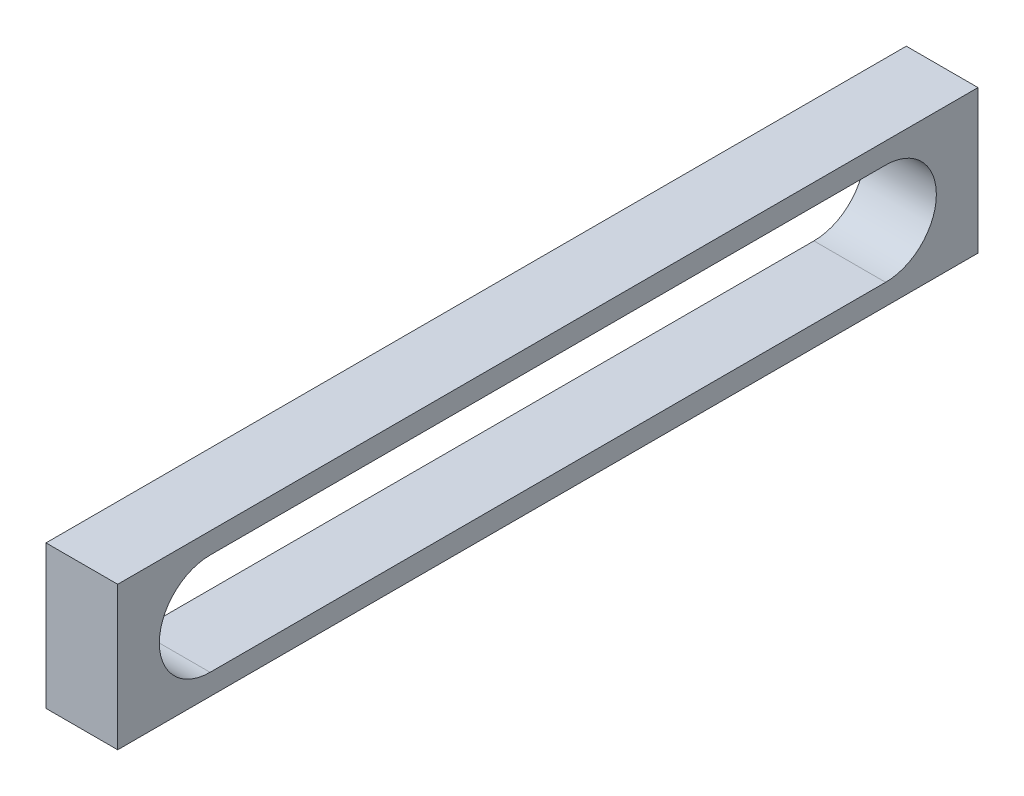
ISO-10303-21;
HEADER;
FILE_DESCRIPTION(('STEP AP214'),'2;1');
FILE_NAME('part.step','',(''),(''),'','','');
FILE_SCHEMA(('AUTOMOTIVE_DESIGN { 1 0 10303 214 1 1 1 1 }'));
ENDSEC;
DATA;
#1=APPLICATION_CONTEXT('core data for automotive mechanical design processes');
#2=APPLICATION_PROTOCOL_DEFINITION('international standard','automotive_design',2000,#1);
#3=PRODUCT_CONTEXT('',#1,'mechanical');
#4=PRODUCT('Part','Part','',(#3));
#5=PRODUCT_RELATED_PRODUCT_CATEGORY('part','',(#4));
#6=PRODUCT_DEFINITION_FORMATION('','',#4);
#7=PRODUCT_DEFINITION_CONTEXT('part definition',#1,'design');
#8=PRODUCT_DEFINITION('design','',#6,#7);
#9=PRODUCT_DEFINITION_SHAPE('','',#8);
#10=(LENGTH_UNIT() NAMED_UNIT(*) SI_UNIT(.MILLI.,.METRE.));
#11=(NAMED_UNIT(*) PLANE_ANGLE_UNIT() SI_UNIT($,.RADIAN.));
#12=(NAMED_UNIT(*) SI_UNIT($,.STERADIAN.) SOLID_ANGLE_UNIT());
#13=UNCERTAINTY_MEASURE_WITH_UNIT(LENGTH_MEASURE(1.E-05),#10,'distance_accuracy_value','');
#14=(GEOMETRIC_REPRESENTATION_CONTEXT(3) GLOBAL_UNCERTAINTY_ASSIGNED_CONTEXT((#13)) GLOBAL_UNIT_ASSIGNED_CONTEXT((#10,
#11,#12)) REPRESENTATION_CONTEXT('',''));
#15=CARTESIAN_POINT('',(0.,0.,0.));
#16=DIRECTION('',(0.,0.,1.));
#17=DIRECTION('',(1.,0.,0.));
#18=AXIS2_PLACEMENT_3D('',#15,#16,#17);
#19=CARTESIAN_POINT('',(12.7,0.,0.));
#20=DIRECTION('',(0.,0.,1.));
#21=DIRECTION('',(0.,-1.,0.));
#22=AXIS2_PLACEMENT_3D('',#19,#20,#21);
#23=PLANE('',#22);
#24=DIRECTION('',(0.,1.,0.));
#25=VECTOR('',#24,1.);
#26=CARTESIAN_POINT('',(0.,0.,0.));
#27=LINE('',#26,#25);
#28=CARTESIAN_POINT('',(0.,0.,0.));
#29=VERTEX_POINT('',#28);
#30=CARTESIAN_POINT('',(0.,25.4,0.));
#31=VERTEX_POINT('',#30);
#32=EDGE_CURVE('E124',#29,#31,#27,.T.);
#33=ORIENTED_EDGE('',*,*,#32,.T.);
#34=DIRECTION('',(-1.,0.,0.));
#35=VECTOR('',#34,1.);
#36=CARTESIAN_POINT('',(12.7,25.4,0.));
#37=LINE('',#36,#35);
#38=CARTESIAN_POINT('',(12.7,25.4,0.));
#39=VERTEX_POINT('',#38);
#40=EDGE_CURVE('E11',#39,#31,#37,.T.);
#41=ORIENTED_EDGE('',*,*,#40,.F.);
#42=DIRECTION('',(0.,1.,0.));
#43=VECTOR('',#42,1.);
#44=CARTESIAN_POINT('',(12.7,0.,0.));
#45=LINE('',#44,#43);
#46=CARTESIAN_POINT('',(12.7,0.,0.));
#47=VERTEX_POINT('',#46);
#48=EDGE_CURVE('E156',#47,#39,#45,.T.);
#49=ORIENTED_EDGE('',*,*,#48,.F.);
#50=DIRECTION('',(-1.,0.,0.));
#51=VECTOR('',#50,1.);
#52=CARTESIAN_POINT('',(12.7,0.,0.));
#53=LINE('',#52,#51);
#54=EDGE_CURVE('E170',#47,#29,#53,.T.);
#55=ORIENTED_EDGE('',*,*,#54,.T.);
#56=EDGE_LOOP('',(#33,#41,#49,#55));
#57=FACE_BOUND('',#56,.T.);
#58=ADVANCED_FACE('F43',(#57),#23,.F.);
#59=CARTESIAN_POINT('',(12.7,25.4,0.));
#60=DIRECTION('',(0.,-1.,0.));
#61=DIRECTION('',(0.,0.,-1.));
#62=AXIS2_PLACEMENT_3D('',#59,#60,#61);
#63=PLANE('',#62);
#64=DIRECTION('',(0.,0.,1.));
#65=VECTOR('',#64,1.);
#66=CARTESIAN_POINT('',(0.,25.4,0.));
#67=LINE('',#66,#65);
#68=CARTESIAN_POINT('',(0.,25.4,152.4));
#69=VERTEX_POINT('',#68);
#70=EDGE_CURVE('E174',#31,#69,#67,.T.);
#71=ORIENTED_EDGE('',*,*,#70,.T.);
#72=DIRECTION('',(-1.,0.,0.));
#73=VECTOR('',#72,1.);
#74=CARTESIAN_POINT('',(12.7,25.4,152.4));
#75=LINE('',#74,#73);
#76=CARTESIAN_POINT('',(12.7,25.4,152.4));
#77=VERTEX_POINT('',#76);
#78=EDGE_CURVE('E51',#77,#69,#75,.T.);
#79=ORIENTED_EDGE('',*,*,#78,.F.);
#80=DIRECTION('',(0.,0.,1.));
#81=VECTOR('',#80,1.);
#82=CARTESIAN_POINT('',(12.7,25.4,0.));
#83=LINE('',#82,#81);
#84=EDGE_CURVE('E160',#39,#77,#83,.T.);
#85=ORIENTED_EDGE('',*,*,#84,.F.);
#86=ORIENTED_EDGE('',*,*,#40,.T.);
#87=EDGE_LOOP('',(#71,#79,#85,#86));
#88=FACE_BOUND('',#87,.T.);
#89=ADVANCED_FACE('F208',(#88),#63,.F.);
#90=CARTESIAN_POINT('',(12.7,0.,152.4));
#91=DIRECTION('',(0.,0.,-1.));
#92=DIRECTION('',(-1.,0.,0.));
#93=AXIS2_PLACEMENT_3D('',#90,#91,#92);
#94=PLANE('',#93);
#95=DIRECTION('',(0.,-1.,0.));
#96=VECTOR('',#95,1.);
#97=CARTESIAN_POINT('',(0.,0.,152.4));
#98=LINE('',#97,#96);
#99=CARTESIAN_POINT('',(0.,0.,152.4));
#100=VERTEX_POINT('',#99);
#101=EDGE_CURVE('E177',#69,#100,#98,.T.);
#102=ORIENTED_EDGE('',*,*,#101,.T.);
#103=DIRECTION('',(-1.,0.,0.));
#104=VECTOR('',#103,1.);
#105=CARTESIAN_POINT('',(12.7,0.,152.4));
#106=LINE('',#105,#104);
#107=CARTESIAN_POINT('',(12.7,0.,152.4));
#108=VERTEX_POINT('',#107);
#109=EDGE_CURVE('E185',#108,#100,#106,.T.);
#110=ORIENTED_EDGE('',*,*,#109,.F.);
#111=DIRECTION('',(0.,-1.,0.));
#112=VECTOR('',#111,1.);
#113=CARTESIAN_POINT('',(12.7,0.,152.4));
#114=LINE('',#113,#112);
#115=EDGE_CURVE('E164',#77,#108,#114,.T.);
#116=ORIENTED_EDGE('',*,*,#115,.F.);
#117=ORIENTED_EDGE('',*,*,#78,.T.);
#118=EDGE_LOOP('',(#102,#110,#116,#117));
#119=FACE_BOUND('',#118,.T.);
#120=ADVANCED_FACE('F194',(#119),#94,.F.);
#121=CARTESIAN_POINT('',(12.7,0.,0.));
#122=DIRECTION('',(0.,1.,0.));
#123=DIRECTION('',(0.,0.,1.));
#124=AXIS2_PLACEMENT_3D('',#121,#122,#123);
#125=PLANE('',#124);
#126=DIRECTION('',(0.,0.,-1.));
#127=VECTOR('',#126,1.);
#128=CARTESIAN_POINT('',(0.,0.,0.));
#129=LINE('',#128,#127);
#130=EDGE_CURVE('E161',#100,#29,#129,.T.);
#131=ORIENTED_EDGE('',*,*,#130,.T.);
#132=ORIENTED_EDGE('',*,*,#54,.F.);
#133=DIRECTION('',(0.,0.,-1.));
#134=VECTOR('',#133,1.);
#135=CARTESIAN_POINT('',(12.7,0.,0.));
#136=LINE('',#135,#134);
#137=EDGE_CURVE('E167',#108,#47,#136,.T.);
#138=ORIENTED_EDGE('',*,*,#137,.F.);
#139=ORIENTED_EDGE('',*,*,#109,.T.);
#140=EDGE_LOOP('',(#131,#132,#138,#139));
#141=FACE_BOUND('',#140,.T.);
#142=ADVANCED_FACE('F201',(#141),#125,.F.);
#143=CARTESIAN_POINT('',(12.7,0.,0.));
#144=DIRECTION('',(1.,0.,0.));
#145=DIRECTION('',(0.,0.,-1.));
#146=AXIS2_PLACEMENT_3D('',#143,#144,#145);
#147=PLANE('',#146);
#148=CARTESIAN_POINT('',(12.7,12.7,136.033448355187));
#149=DIRECTION('',(1.,0.,0.));
#150=DIRECTION('',(0.,0.,-1.));
#151=AXIS2_PLACEMENT_3D('',#148,#149,#150);
#152=CIRCLE('',#151,8.99084286875344);
#153=CARTESIAN_POINT('',(12.7,21.6908428687534,136.033448355187));
#154=VERTEX_POINT('',#153);
#155=CARTESIAN_POINT('',(12.7,3.70915713124654,136.033448355187));
#156=VERTEX_POINT('',#155);
#157=EDGE_CURVE('E58',#154,#156,#152,.T.);
#158=ORIENTED_EDGE('',*,*,#157,.F.);
#159=DIRECTION('',(0.,0.,1.));
#160=VECTOR('',#159,1.);
#161=CARTESIAN_POINT('',(12.7,21.6908428687534,136.033448355187));
#162=LINE('',#161,#160);
#163=CARTESIAN_POINT('',(12.7,21.6908428687534,16.3665516448125));
#164=VERTEX_POINT('',#163);
#165=EDGE_CURVE('E117',#164,#154,#162,.T.);
#166=ORIENTED_EDGE('',*,*,#165,.F.);
#167=CARTESIAN_POINT('',(12.7,12.7,16.3665516448125));
#168=DIRECTION('',(1.,0.,0.));
#169=DIRECTION('',(0.,0.,-1.));
#170=AXIS2_PLACEMENT_3D('',#167,#168,#169);
#171=CIRCLE('',#170,8.99084286875344);
#172=CARTESIAN_POINT('',(12.7,3.70915713124654,16.3665516448125));
#173=VERTEX_POINT('',#172);
#174=EDGE_CURVE('E142',#173,#164,#171,.T.);
#175=ORIENTED_EDGE('',*,*,#174,.F.);
#176=DIRECTION('',(0.,0.,-1.));
#177=VECTOR('',#176,1.);
#178=CARTESIAN_POINT('',(12.7,3.70915713124654,136.033448355187));
#179=LINE('',#178,#177);
#180=EDGE_CURVE('E135',#156,#173,#179,.T.);
#181=ORIENTED_EDGE('',*,*,#180,.F.);
#182=EDGE_LOOP('',(#158,#166,#175,#181));
#183=FACE_BOUND('',#182,.T.);
#184=ORIENTED_EDGE('',*,*,#48,.T.);
#185=ORIENTED_EDGE('',*,*,#84,.T.);
#186=ORIENTED_EDGE('',*,*,#115,.T.);
#187=ORIENTED_EDGE('',*,*,#137,.T.);
#188=EDGE_LOOP('',(#184,#185,#186,#187));
#189=FACE_BOUND('',#188,.T.);
#190=ADVANCED_FACE('F207',(#183,#189),#147,.T.);
#191=CARTESIAN_POINT('',(0.,0.,0.));
#192=DIRECTION('',(1.,0.,0.));
#193=DIRECTION('',(0.,0.,-1.));
#194=AXIS2_PLACEMENT_3D('',#191,#192,#193);
#195=PLANE('',#194);
#196=DIRECTION('',(0.,0.,-1.));
#197=VECTOR('',#196,1.);
#198=CARTESIAN_POINT('',(0.,21.6908428687534,136.033448355187));
#199=LINE('',#198,#197);
#200=CARTESIAN_POINT('',(0.,21.6908428687534,136.033448355187));
#201=VERTEX_POINT('',#200);
#202=CARTESIAN_POINT('',(0.,21.6908428687534,16.3665516448125));
#203=VERTEX_POINT('',#202);
#204=EDGE_CURVE('E130',#201,#203,#199,.T.);
#205=ORIENTED_EDGE('',*,*,#204,.F.);
#206=CARTESIAN_POINT('',(0.,12.7,136.033448355187));
#207=DIRECTION('',(1.,0.,0.));
#208=DIRECTION('',(0.,0.,-1.));
#209=AXIS2_PLACEMENT_3D('',#206,#207,#208);
#210=CIRCLE('',#209,8.99084286875344);
#211=CARTESIAN_POINT('',(0.,3.70915713124654,136.033448355187));
#212=VERTEX_POINT('',#211);
#213=EDGE_CURVE('E110',#212,#201,#210,.F.);
#214=ORIENTED_EDGE('',*,*,#213,.F.);
#215=DIRECTION('',(0.,0.,1.));
#216=VECTOR('',#215,1.);
#217=CARTESIAN_POINT('',(0.,3.70915713124654,136.033448355187));
#218=LINE('',#217,#216);
#219=CARTESIAN_POINT('',(0.,3.70915713124656,16.3665516448125));
#220=VERTEX_POINT('',#219);
#221=EDGE_CURVE('E120',#220,#212,#218,.T.);
#222=ORIENTED_EDGE('',*,*,#221,.F.);
#223=CARTESIAN_POINT('',(0.,12.7,16.3665516448125));
#224=DIRECTION('',(1.,0.,0.));
#225=DIRECTION('',(0.,0.,-1.));
#226=AXIS2_PLACEMENT_3D('',#223,#224,#225);
#227=CIRCLE('',#226,8.99084286875344);
#228=EDGE_CURVE('E66',#203,#220,#227,.F.);
#229=ORIENTED_EDGE('',*,*,#228,.F.);
#230=EDGE_LOOP('',(#205,#214,#222,#229));
#231=FACE_BOUND('',#230,.T.);
#232=ORIENTED_EDGE('',*,*,#32,.F.);
#233=ORIENTED_EDGE('',*,*,#130,.F.);
#234=ORIENTED_EDGE('',*,*,#101,.F.);
#235=ORIENTED_EDGE('',*,*,#70,.F.);
#236=EDGE_LOOP('',(#232,#233,#234,#235));
#237=FACE_BOUND('',#236,.T.);
#238=ADVANCED_FACE('F127',(#231,#237),#195,.F.);
#239=CARTESIAN_POINT('',(-0.000999999999999265,12.7,136.033448355187));
#240=DIRECTION('',(1.,0.,0.));
#241=DIRECTION('',(0.,0.,-1.));
#242=AXIS2_PLACEMENT_3D('',#239,#240,#241);
#243=CYLINDRICAL_SURFACE('',#242,8.99084286875344);
#244=ORIENTED_EDGE('',*,*,#213,.T.);
#245=DIRECTION('',(1.,0.,0.));
#246=VECTOR('',#245,1.);
#247=CARTESIAN_POINT('',(-0.000999999999999265,21.6908428687534,136.033448355187));
#248=LINE('',#247,#246);
#249=EDGE_CURVE('E125',#201,#154,#248,.T.);
#250=ORIENTED_EDGE('',*,*,#249,.T.);
#251=ORIENTED_EDGE('',*,*,#157,.T.);
#252=DIRECTION('',(1.,0.,0.));
#253=VECTOR('',#252,1.);
#254=CARTESIAN_POINT('',(-0.000999999999999265,3.70915713124654,136.033448355187));
#255=LINE('',#254,#253);
#256=EDGE_CURVE('E106',#212,#156,#255,.T.);
#257=ORIENTED_EDGE('',*,*,#256,.F.);
#258=EDGE_LOOP('',(#244,#250,#251,#257));
#259=FACE_BOUND('',#258,.T.);
#260=ADVANCED_FACE('F108',(#259),#243,.F.);
#261=CARTESIAN_POINT('',(-0.000999999999999265,21.6908428687534,136.033448355187));
#262=DIRECTION('',(0.,1.,0.));
#263=DIRECTION('',(0.,0.,1.));
#264=AXIS2_PLACEMENT_3D('',#261,#262,#263);
#265=PLANE('',#264);
#266=ORIENTED_EDGE('',*,*,#204,.T.);
#267=DIRECTION('',(1.,0.,0.));
#268=VECTOR('',#267,1.);
#269=CARTESIAN_POINT('',(-0.000999999999999265,21.6908428687534,16.3665516448125));
#270=LINE('',#269,#268);
#271=EDGE_CURVE('E151',#203,#164,#270,.T.);
#272=ORIENTED_EDGE('',*,*,#271,.T.);
#273=ORIENTED_EDGE('',*,*,#165,.T.);
#274=ORIENTED_EDGE('',*,*,#249,.F.);
#275=EDGE_LOOP('',(#266,#272,#273,#274));
#276=FACE_BOUND('',#275,.T.);
#277=ADVANCED_FACE('F225',(#276),#265,.F.);
#278=CARTESIAN_POINT('',(-0.000999999999999265,12.7,16.3665516448125));
#279=DIRECTION('',(1.,0.,0.));
#280=DIRECTION('',(0.,0.,-1.));
#281=AXIS2_PLACEMENT_3D('',#278,#279,#280);
#282=CYLINDRICAL_SURFACE('',#281,8.99084286875344);
#283=ORIENTED_EDGE('',*,*,#228,.T.);
#284=DIRECTION('',(1.,0.,0.));
#285=VECTOR('',#284,1.);
#286=CARTESIAN_POINT('',(-0.000999999999999265,3.70915713124654,16.3665516448125));
#287=LINE('',#286,#285);
#288=EDGE_CURVE('E116',#220,#173,#287,.T.);
#289=ORIENTED_EDGE('',*,*,#288,.T.);
#290=ORIENTED_EDGE('',*,*,#174,.T.);
#291=ORIENTED_EDGE('',*,*,#271,.F.);
#292=EDGE_LOOP('',(#283,#289,#290,#291));
#293=FACE_BOUND('',#292,.T.);
#294=ADVANCED_FACE('F228',(#293),#282,.F.);
#295=CARTESIAN_POINT('',(-0.000999999999999265,3.70915713124654,136.033448355187));
#296=DIRECTION('',(0.,-1.,0.));
#297=DIRECTION('',(0.,0.,-1.));
#298=AXIS2_PLACEMENT_3D('',#295,#296,#297);
#299=PLANE('',#298);
#300=ORIENTED_EDGE('',*,*,#221,.T.);
#301=ORIENTED_EDGE('',*,*,#256,.T.);
#302=ORIENTED_EDGE('',*,*,#180,.T.);
#303=ORIENTED_EDGE('',*,*,#288,.F.);
#304=EDGE_LOOP('',(#300,#301,#302,#303));
#305=FACE_BOUND('',#304,.T.);
#306=ADVANCED_FACE('F121',(#305),#299,.F.);
#307=CLOSED_SHELL('',(#58,#89,#120,#142,#190,#238,#260,#277,#294,#306));
#308=MANIFOLD_SOLID_BREP('B2',#307);
#309=ADVANCED_BREP_SHAPE_REPRESENTATION('',(#18,#308),#14);
#310=SHAPE_DEFINITION_REPRESENTATION(#9,#309);
ENDSEC;
END-ISO-10303-21;
